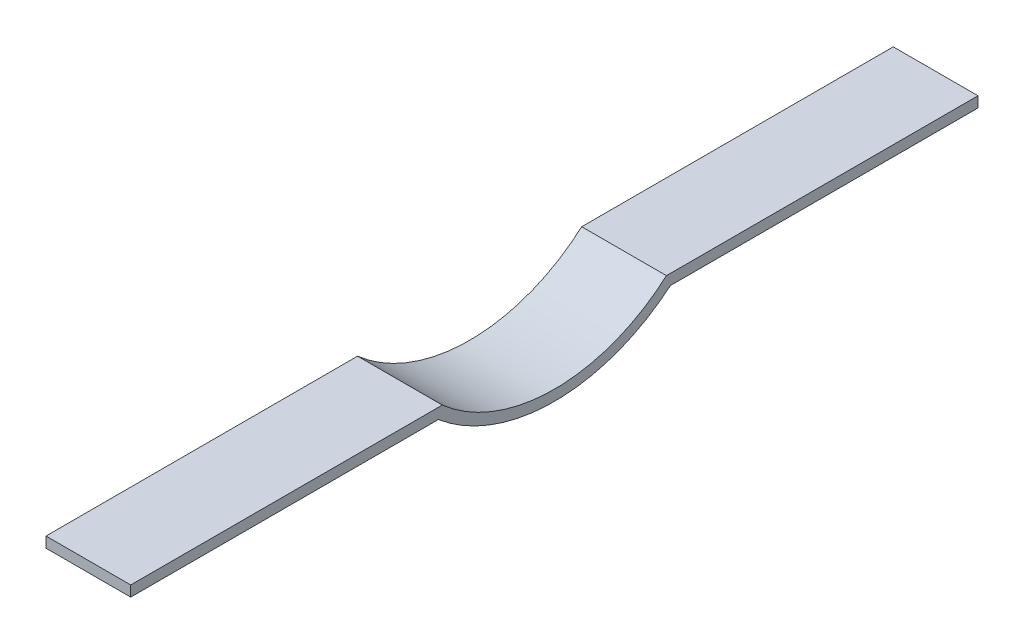
ISO-10303-21;
HEADER;
FILE_DESCRIPTION(('STEP AP214'),'2;1');
FILE_NAME('part.step','',(''),(''),'','','');
FILE_SCHEMA(('AUTOMOTIVE_DESIGN { 1 0 10303 214 1 1 1 1 }'));
ENDSEC;
DATA;
#1=APPLICATION_CONTEXT('core data for automotive mechanical design processes');
#2=APPLICATION_PROTOCOL_DEFINITION('international standard','automotive_design',2000,#1);
#3=PRODUCT_CONTEXT('',#1,'mechanical');
#4=PRODUCT('Part','Part','',(#3));
#5=PRODUCT_RELATED_PRODUCT_CATEGORY('part','',(#4));
#6=PRODUCT_DEFINITION_FORMATION('','',#4);
#7=PRODUCT_DEFINITION_CONTEXT('part definition',#1,'design');
#8=PRODUCT_DEFINITION('design','',#6,#7);
#9=PRODUCT_DEFINITION_SHAPE('','',#8);
#10=(LENGTH_UNIT() NAMED_UNIT(*) SI_UNIT(.MILLI.,.METRE.));
#11=(NAMED_UNIT(*) PLANE_ANGLE_UNIT() SI_UNIT($,.RADIAN.));
#12=(NAMED_UNIT(*) SI_UNIT($,.STERADIAN.) SOLID_ANGLE_UNIT());
#13=UNCERTAINTY_MEASURE_WITH_UNIT(LENGTH_MEASURE(1.E-05),#10,'distance_accuracy_value','');
#14=(GEOMETRIC_REPRESENTATION_CONTEXT(3) GLOBAL_UNCERTAINTY_ASSIGNED_CONTEXT((#13)) GLOBAL_UNIT_ASSIGNED_CONTEXT((#10,
#11,#12)) REPRESENTATION_CONTEXT('',''));
#15=CARTESIAN_POINT('',(0.,0.,0.));
#16=DIRECTION('',(0.,0.,1.));
#17=DIRECTION('',(1.,0.,0.));
#18=AXIS2_PLACEMENT_3D('',#15,#16,#17);
#19=CARTESIAN_POINT('',(25.4,0.,0.));
#20=DIRECTION('',(-1.,0.,0.));
#21=DIRECTION('',(0.,0.,1.));
#22=AXIS2_PLACEMENT_3D('',#19,#20,#21);
#23=CYLINDRICAL_SURFACE('',#22,107.95);
#24=DIRECTION('',(-1.,0.,0.));
#25=VECTOR('',#24,1.);
#26=CARTESIAN_POINT('',(25.4,-82.55,-69.5607648031561));
#27=LINE('',#26,#25);
#28=CARTESIAN_POINT('',(-25.4,-82.55,-69.5607648031561));
#29=VERTEX_POINT('',#28);
#30=CARTESIAN_POINT('',(25.4,-82.55,-69.5607648031561));
#31=VERTEX_POINT('',#30);
#32=EDGE_CURVE('E50',#29,#31,#27,.F.);
#33=ORIENTED_EDGE('',*,*,#32,.T.);
#34=CARTESIAN_POINT('',(25.4,0.,0.));
#35=DIRECTION('',(1.,0.,0.));
#36=DIRECTION('',(0.,0.,1.));
#37=AXIS2_PLACEMENT_3D('',#34,#35,#36);
#38=CIRCLE('',#37,107.95);
#39=CARTESIAN_POINT('',(25.4,-82.55,69.5607648031561));
#40=VERTEX_POINT('',#39);
#41=EDGE_CURVE('E152',#40,#31,#38,.T.);
#42=ORIENTED_EDGE('',*,*,#41,.F.);
#43=DIRECTION('',(-1.,0.,0.));
#44=VECTOR('',#43,1.);
#45=CARTESIAN_POINT('',(25.4,-82.55,69.5607648031561));
#46=LINE('',#45,#44);
#47=CARTESIAN_POINT('',(-25.4,-82.55,69.5607648031561));
#48=VERTEX_POINT('',#47);
#49=EDGE_CURVE('E121',#48,#40,#46,.F.);
#50=ORIENTED_EDGE('',*,*,#49,.F.);
#51=CARTESIAN_POINT('',(-25.4,0.,0.));
#52=DIRECTION('',(1.,0.,0.));
#53=DIRECTION('',(0.,0.,1.));
#54=AXIS2_PLACEMENT_3D('',#51,#52,#53);
#55=CIRCLE('',#54,107.95);
#56=EDGE_CURVE('E55',#48,#29,#55,.T.);
#57=ORIENTED_EDGE('',*,*,#56,.T.);
#58=EDGE_LOOP('',(#33,#42,#50,#57));
#59=FACE_BOUND('',#58,.T.);
#60=ADVANCED_FACE('F35',(#59),#23,.T.);
#61=CARTESIAN_POINT('',(25.4,0.,0.));
#62=DIRECTION('',(-1.,0.,0.));
#63=DIRECTION('',(0.,0.,1.));
#64=AXIS2_PLACEMENT_3D('',#61,#62,#63);
#65=CYLINDRICAL_SURFACE('',#64,101.6);
#66=CARTESIAN_POINT('',(-25.4,0.,0.));
#67=DIRECTION('',(-1.,0.,0.));
#68=DIRECTION('',(0.,0.,1.));
#69=AXIS2_PLACEMENT_3D('',#66,#67,#68);
#70=CIRCLE('',#69,101.6);
#71=CARTESIAN_POINT('',(-25.4,-76.2,-67.2020833010406));
#72=VERTEX_POINT('',#71);
#73=CARTESIAN_POINT('',(-25.4,-76.2,67.2020833010406));
#74=VERTEX_POINT('',#73);
#75=EDGE_CURVE('E142',#72,#74,#70,.T.);
#76=ORIENTED_EDGE('',*,*,#75,.T.);
#77=DIRECTION('',(-1.,0.,0.));
#78=VECTOR('',#77,1.);
#79=CARTESIAN_POINT('',(25.4,-76.2,67.2020833010406));
#80=LINE('',#79,#78);
#81=CARTESIAN_POINT('',(25.4,-76.2,67.2020833010406));
#82=VERTEX_POINT('',#81);
#83=EDGE_CURVE('E11',#82,#74,#80,.T.);
#84=ORIENTED_EDGE('',*,*,#83,.F.);
#85=CARTESIAN_POINT('',(25.4,0.,0.));
#86=DIRECTION('',(-1.,0.,0.));
#87=DIRECTION('',(0.,0.,1.));
#88=AXIS2_PLACEMENT_3D('',#85,#86,#87);
#89=CIRCLE('',#88,101.6);
#90=CARTESIAN_POINT('',(25.4,-76.2,-67.2020833010406));
#91=VERTEX_POINT('',#90);
#92=EDGE_CURVE('E147',#91,#82,#89,.T.);
#93=ORIENTED_EDGE('',*,*,#92,.F.);
#94=DIRECTION('',(-1.,0.,0.));
#95=VECTOR('',#94,1.);
#96=CARTESIAN_POINT('',(25.4,-76.2,-67.2020833010406));
#97=LINE('',#96,#95);
#98=EDGE_CURVE('E43',#91,#72,#97,.T.);
#99=ORIENTED_EDGE('',*,*,#98,.T.);
#100=EDGE_LOOP('',(#76,#84,#93,#99));
#101=FACE_BOUND('',#100,.T.);
#102=ADVANCED_FACE('F37',(#101),#65,.F.);
#103=CARTESIAN_POINT('',(25.4,-76.2,76.4641255753311));
#104=DIRECTION('',(0.,-1.,0.));
#105=DIRECTION('',(0.,0.,-1.));
#106=AXIS2_PLACEMENT_3D('',#103,#104,#105);
#107=PLANE('',#106);
#108=DIRECTION('',(0.,0.,1.));
#109=VECTOR('',#108,1.);
#110=CARTESIAN_POINT('',(-25.4,-76.2,76.4641255753311));
#111=LINE('',#110,#109);
#112=CARTESIAN_POINT('',(-25.4,-76.2,254.));
#113=VERTEX_POINT('',#112);
#114=EDGE_CURVE('E158',#74,#113,#111,.T.);
#115=ORIENTED_EDGE('',*,*,#114,.T.);
#116=DIRECTION('',(-1.,0.,0.));
#117=VECTOR('',#116,1.);
#118=CARTESIAN_POINT('',(-25.4,-76.2,254.));
#119=LINE('',#118,#117);
#120=CARTESIAN_POINT('',(25.4,-76.2,254.));
#121=VERTEX_POINT('',#120);
#122=EDGE_CURVE('E135',#121,#113,#119,.T.);
#123=ORIENTED_EDGE('',*,*,#122,.F.);
#124=DIRECTION('',(0.,0.,1.));
#125=VECTOR('',#124,1.);
#126=CARTESIAN_POINT('',(25.4,-76.2,76.4641255753311));
#127=LINE('',#126,#125);
#128=EDGE_CURVE('E150',#82,#121,#127,.T.);
#129=ORIENTED_EDGE('',*,*,#128,.F.);
#130=ORIENTED_EDGE('',*,*,#83,.T.);
#131=EDGE_LOOP('',(#115,#123,#129,#130));
#132=FACE_BOUND('',#131,.T.);
#133=ADVANCED_FACE('F170',(#132),#107,.F.);
#134=CARTESIAN_POINT('',(25.4,-76.2,-67.2020833010406));
#135=DIRECTION('',(0.,-1.,0.));
#136=DIRECTION('',(0.,0.,-1.));
#137=AXIS2_PLACEMENT_3D('',#134,#135,#136);
#138=PLANE('',#137);
#139=DIRECTION('',(0.,0.,1.));
#140=VECTOR('',#139,1.);
#141=CARTESIAN_POINT('',(-25.4,-76.2,-67.2020833010406));
#142=LINE('',#141,#140);
#143=CARTESIAN_POINT('',(-25.4,-76.2,-254.));
#144=VERTEX_POINT('',#143);
#145=EDGE_CURVE('E119',#144,#72,#142,.T.);
#146=ORIENTED_EDGE('',*,*,#145,.T.);
#147=ORIENTED_EDGE('',*,*,#98,.F.);
#148=DIRECTION('',(0.,0.,1.));
#149=VECTOR('',#148,1.);
#150=CARTESIAN_POINT('',(25.4,-76.2,-67.2020833010406));
#151=LINE('',#150,#149);
#152=CARTESIAN_POINT('',(25.4,-76.2,-254.));
#153=VERTEX_POINT('',#152);
#154=EDGE_CURVE('E154',#153,#91,#151,.T.);
#155=ORIENTED_EDGE('',*,*,#154,.F.);
#156=DIRECTION('',(-1.,0.,0.));
#157=VECTOR('',#156,1.);
#158=CARTESIAN_POINT('',(-25.4,-76.2,-254.));
#159=LINE('',#158,#157);
#160=EDGE_CURVE('E106',#153,#144,#159,.T.);
#161=ORIENTED_EDGE('',*,*,#160,.T.);
#162=EDGE_LOOP('',(#146,#147,#155,#161));
#163=FACE_BOUND('',#162,.T.);
#164=ADVANCED_FACE('F174',(#163),#138,.F.);
#165=CARTESIAN_POINT('',(25.4,0.,0.));
#166=DIRECTION('',(-1.,0.,0.));
#167=DIRECTION('',(0.,0.,1.));
#168=AXIS2_PLACEMENT_3D('',#165,#166,#167);
#169=PLANE('',#168);
#170=ORIENTED_EDGE('',*,*,#92,.T.);
#171=ORIENTED_EDGE('',*,*,#128,.T.);
#172=DIRECTION('',(0.,1.,0.));
#173=VECTOR('',#172,1.);
#174=CARTESIAN_POINT('',(25.4,-76.2,254.));
#175=LINE('',#174,#173);
#176=CARTESIAN_POINT('',(25.4,-82.55,254.));
#177=VERTEX_POINT('',#176);
#178=EDGE_CURVE('E131',#177,#121,#175,.T.);
#179=ORIENTED_EDGE('',*,*,#178,.F.);
#180=DIRECTION('',(0.,0.,1.));
#181=VECTOR('',#180,1.);
#182=CARTESIAN_POINT('',(25.4,-82.55,-76.4661255753311));
#183=LINE('',#182,#181);
#184=EDGE_CURVE('E138',#40,#177,#183,.T.);
#185=ORIENTED_EDGE('',*,*,#184,.F.);
#186=ORIENTED_EDGE('',*,*,#41,.T.);
#187=DIRECTION('',(0.,0.,-1.));
#188=VECTOR('',#187,1.);
#189=CARTESIAN_POINT('',(25.4,-82.55,254.002));
#190=LINE('',#189,#188);
#191=CARTESIAN_POINT('',(25.4,-82.55,-254.));
#192=VERTEX_POINT('',#191);
#193=EDGE_CURVE('E107',#31,#192,#190,.T.);
#194=ORIENTED_EDGE('',*,*,#193,.T.);
#195=DIRECTION('',(0.,1.,0.));
#196=VECTOR('',#195,1.);
#197=CARTESIAN_POINT('',(25.4,-76.2,-254.));
#198=LINE('',#197,#196);
#199=EDGE_CURVE('E115',#192,#153,#198,.T.);
#200=ORIENTED_EDGE('',*,*,#199,.T.);
#201=ORIENTED_EDGE('',*,*,#154,.T.);
#202=EDGE_LOOP('',(#170,#171,#179,#185,#186,#194,#200,#201));
#203=FACE_BOUND('',#202,.T.);
#204=ADVANCED_FACE('F173',(#203),#169,.F.);
#205=CARTESIAN_POINT('',(-25.4,0.,0.));
#206=DIRECTION('',(-1.,0.,0.));
#207=DIRECTION('',(0.,0.,1.));
#208=AXIS2_PLACEMENT_3D('',#205,#206,#207);
#209=PLANE('',#208);
#210=ORIENTED_EDGE('',*,*,#75,.F.);
#211=ORIENTED_EDGE('',*,*,#145,.F.);
#212=DIRECTION('',(0.,-1.,0.));
#213=VECTOR('',#212,1.);
#214=CARTESIAN_POINT('',(-25.4,-76.2,-254.));
#215=LINE('',#214,#213);
#216=CARTESIAN_POINT('',(-25.4,-82.55,-254.));
#217=VERTEX_POINT('',#216);
#218=EDGE_CURVE('E113',#144,#217,#215,.T.);
#219=ORIENTED_EDGE('',*,*,#218,.T.);
#220=DIRECTION('',(0.,0.,-1.));
#221=VECTOR('',#220,1.);
#222=CARTESIAN_POINT('',(-25.4,-82.55,254.002));
#223=LINE('',#222,#221);
#224=EDGE_CURVE('E98',#29,#217,#223,.T.);
#225=ORIENTED_EDGE('',*,*,#224,.F.);
#226=ORIENTED_EDGE('',*,*,#56,.F.);
#227=DIRECTION('',(0.,0.,1.));
#228=VECTOR('',#227,1.);
#229=CARTESIAN_POINT('',(-25.4,-82.55,-76.4661255753311));
#230=LINE('',#229,#228);
#231=CARTESIAN_POINT('',(-25.4,-82.55,254.));
#232=VERTEX_POINT('',#231);
#233=EDGE_CURVE('E124',#48,#232,#230,.T.);
#234=ORIENTED_EDGE('',*,*,#233,.T.);
#235=DIRECTION('',(0.,-1.,0.));
#236=VECTOR('',#235,1.);
#237=CARTESIAN_POINT('',(-25.4,-76.2,254.));
#238=LINE('',#237,#236);
#239=EDGE_CURVE('E139',#113,#232,#238,.T.);
#240=ORIENTED_EDGE('',*,*,#239,.F.);
#241=ORIENTED_EDGE('',*,*,#114,.F.);
#242=EDGE_LOOP('',(#210,#211,#219,#225,#226,#234,#240,#241));
#243=FACE_BOUND('',#242,.T.);
#244=ADVANCED_FACE('F118',(#243),#209,.T.);
#245=CARTESIAN_POINT('',(-25.4,-82.55,-76.4661255753311));
#246=DIRECTION('',(0.,-1.,0.));
#247=DIRECTION('',(0.,0.,-1.));
#248=AXIS2_PLACEMENT_3D('',#245,#246,#247);
#249=PLANE('',#248);
#250=ORIENTED_EDGE('',*,*,#233,.F.);
#251=ORIENTED_EDGE('',*,*,#49,.T.);
#252=ORIENTED_EDGE('',*,*,#184,.T.);
#253=DIRECTION('',(1.,0.,0.));
#254=VECTOR('',#253,1.);
#255=CARTESIAN_POINT('',(-25.4,-82.55,254.));
#256=LINE('',#255,#254);
#257=EDGE_CURVE('E134',#232,#177,#256,.T.);
#258=ORIENTED_EDGE('',*,*,#257,.F.);
#259=EDGE_LOOP('',(#250,#251,#252,#258));
#260=FACE_BOUND('',#259,.T.);
#261=ADVANCED_FACE('F202',(#260),#249,.T.);
#262=CARTESIAN_POINT('',(0.,0.,254.));
#263=DIRECTION('',(0.,0.,1.));
#264=DIRECTION('',(1.,0.,0.));
#265=AXIS2_PLACEMENT_3D('',#262,#263,#264);
#266=PLANE('',#265);
#267=ORIENTED_EDGE('',*,*,#239,.T.);
#268=ORIENTED_EDGE('',*,*,#257,.T.);
#269=ORIENTED_EDGE('',*,*,#178,.T.);
#270=ORIENTED_EDGE('',*,*,#122,.T.);
#271=EDGE_LOOP('',(#267,#268,#269,#270));
#272=FACE_BOUND('',#271,.T.);
#273=ADVANCED_FACE('F207',(#272),#266,.T.);
#274=CARTESIAN_POINT('',(0.,0.,-254.));
#275=DIRECTION('',(0.,0.,-1.));
#276=DIRECTION('',(1.,0.,0.));
#277=AXIS2_PLACEMENT_3D('',#274,#275,#276);
#278=PLANE('',#277);
#279=ORIENTED_EDGE('',*,*,#218,.F.);
#280=ORIENTED_EDGE('',*,*,#160,.F.);
#281=ORIENTED_EDGE('',*,*,#199,.F.);
#282=DIRECTION('',(1.,0.,0.));
#283=VECTOR('',#282,1.);
#284=CARTESIAN_POINT('',(-25.4,-82.55,-254.));
#285=LINE('',#284,#283);
#286=EDGE_CURVE('E102',#217,#192,#285,.T.);
#287=ORIENTED_EDGE('',*,*,#286,.F.);
#288=EDGE_LOOP('',(#279,#280,#281,#287));
#289=FACE_BOUND('',#288,.T.);
#290=ADVANCED_FACE('F111',(#289),#278,.T.);
#291=CARTESIAN_POINT('',(-25.4,-82.55,254.002));
#292=DIRECTION('',(0.,1.,0.));
#293=DIRECTION('',(0.,0.,1.));
#294=AXIS2_PLACEMENT_3D('',#291,#292,#293);
#295=PLANE('',#294);
#296=ORIENTED_EDGE('',*,*,#32,.F.);
#297=ORIENTED_EDGE('',*,*,#224,.T.);
#298=ORIENTED_EDGE('',*,*,#286,.T.);
#299=ORIENTED_EDGE('',*,*,#193,.F.);
#300=EDGE_LOOP('',(#296,#297,#298,#299));
#301=FACE_BOUND('',#300,.T.);
#302=ADVANCED_FACE('F100',(#301),#295,.F.);
#303=CLOSED_SHELL('',(#60,#102,#133,#164,#204,#244,#261,#273,#290,#302));
#304=MANIFOLD_SOLID_BREP('B2',#303);
#305=ADVANCED_BREP_SHAPE_REPRESENTATION('',(#18,#304),#14);
#306=SHAPE_DEFINITION_REPRESENTATION(#9,#305);
ENDSEC;
END-ISO-10303-21;
